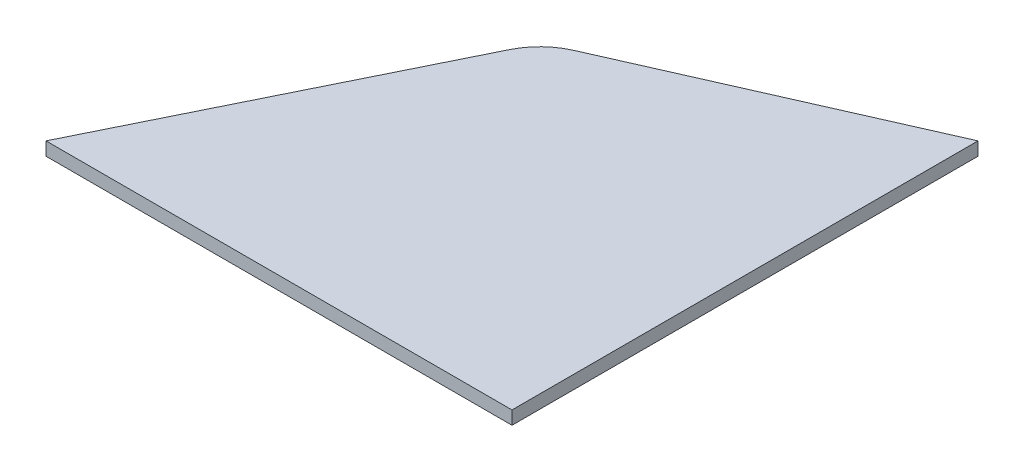
ISO-10303-21;
HEADER;
FILE_DESCRIPTION(('STEP AP214'),'2;1');
FILE_NAME('part.step','',(''),(''),'','','');
FILE_SCHEMA(('AUTOMOTIVE_DESIGN { 1 0 10303 214 1 1 1 1 }'));
ENDSEC;
DATA;
#1=APPLICATION_CONTEXT('core data for automotive mechanical design processes');
#2=APPLICATION_PROTOCOL_DEFINITION('international standard','automotive_design',2000,#1);
#3=PRODUCT_CONTEXT('',#1,'mechanical');
#4=PRODUCT('Part','Part','',(#3));
#5=PRODUCT_RELATED_PRODUCT_CATEGORY('part','',(#4));
#6=PRODUCT_DEFINITION_FORMATION('','',#4);
#7=PRODUCT_DEFINITION_CONTEXT('part definition',#1,'design');
#8=PRODUCT_DEFINITION('design','',#6,#7);
#9=PRODUCT_DEFINITION_SHAPE('','',#8);
#10=(LENGTH_UNIT() NAMED_UNIT(*) SI_UNIT(.MILLI.,.METRE.));
#11=(NAMED_UNIT(*) PLANE_ANGLE_UNIT() SI_UNIT($,.RADIAN.));
#12=(NAMED_UNIT(*) SI_UNIT($,.STERADIAN.) SOLID_ANGLE_UNIT());
#13=UNCERTAINTY_MEASURE_WITH_UNIT(LENGTH_MEASURE(1.E-05),#10,'distance_accuracy_value','');
#14=(GEOMETRIC_REPRESENTATION_CONTEXT(3) GLOBAL_UNCERTAINTY_ASSIGNED_CONTEXT((#13)) GLOBAL_UNIT_ASSIGNED_CONTEXT((#10,
#11,#12)) REPRESENTATION_CONTEXT('',''));
#15=CARTESIAN_POINT('',(0.,0.,0.));
#16=DIRECTION('',(0.,0.,1.));
#17=DIRECTION('',(1.,0.,0.));
#18=AXIS2_PLACEMENT_3D('',#15,#16,#17);
#19=CARTESIAN_POINT('',(24.5442990763072,2.,-49.9521398660407));
#20=DIRECTION('',(0.897508774284861,0.,0.440996598718955));
#21=DIRECTION('',(0.440996598718955,0.,-0.897508774284861));
#22=AXIS2_PLACEMENT_3D('',#19,#20,#21);
#23=PLANE('',#22);
#24=DIRECTION('',(-0.440996598718955,0.,0.897508774284861));
#25=VECTOR('',#24,1.);
#26=CARTESIAN_POINT('',(24.5442990763072,2.,-49.9521398660407));
#27=LINE('',#26,#25);
#28=CARTESIAN_POINT('',(22.9377628448455,2.,-46.6825446625134));
#29=VERTEX_POINT('',#28);
#30=CARTESIAN_POINT('',(0.,2.,0.));
#31=VERTEX_POINT('',#30);
#32=EDGE_CURVE('E86',#29,#31,#27,.T.);
#33=ORIENTED_EDGE('',*,*,#32,.F.);
#34=DIRECTION('',(0.,-1.,0.));
#35=VECTOR('',#34,1.);
#36=CARTESIAN_POINT('',(22.9377628448455,2.,-46.6825446625134));
#37=LINE('',#36,#35);
#38=CARTESIAN_POINT('',(22.9377628448455,0.,-46.6825446625134));
#39=VERTEX_POINT('',#38);
#40=EDGE_CURVE('E112',#29,#39,#37,.T.);
#41=ORIENTED_EDGE('',*,*,#40,.T.);
#42=DIRECTION('',(-0.440996598718955,0.,0.897508774284861));
#43=VECTOR('',#42,1.);
#44=CARTESIAN_POINT('',(24.5442990763072,0.,-49.9521398660407));
#45=LINE('',#44,#43);
#46=CARTESIAN_POINT('',(0.,0.,0.));
#47=VERTEX_POINT('',#46);
#48=EDGE_CURVE('E109',#39,#47,#45,.T.);
#49=ORIENTED_EDGE('',*,*,#48,.T.);
#50=DIRECTION('',(0.,-1.,0.));
#51=VECTOR('',#50,1.);
#52=CARTESIAN_POINT('',(0.,2.,0.));
#53=LINE('',#52,#51);
#54=EDGE_CURVE('E102',#31,#47,#53,.T.);
#55=ORIENTED_EDGE('',*,*,#54,.F.);
#56=EDGE_LOOP('',(#33,#41,#49,#55));
#57=FACE_BOUND('',#56,.T.);
#58=ADVANCED_FACE('F39',(#57),#23,.F.);
#59=CARTESIAN_POINT('',(0.,2.,0.));
#60=DIRECTION('',(0.,0.,-1.));
#61=DIRECTION('',(-1.,0.,0.));
#62=AXIS2_PLACEMENT_3D('',#59,#60,#61);
#63=PLANE('',#62);
#64=DIRECTION('',(1.,0.,0.));
#65=VECTOR('',#64,1.);
#66=CARTESIAN_POINT('',(0.,0.,0.));
#67=LINE('',#66,#65);
#68=CARTESIAN_POINT('',(70.,0.,0.));
#69=VERTEX_POINT('',#68);
#70=EDGE_CURVE('E132',#47,#69,#67,.T.);
#71=ORIENTED_EDGE('',*,*,#70,.T.);
#72=DIRECTION('',(0.,-1.,0.));
#73=VECTOR('',#72,1.);
#74=CARTESIAN_POINT('',(70.,2.,0.));
#75=LINE('',#74,#73);
#76=CARTESIAN_POINT('',(70.,2.,0.));
#77=VERTEX_POINT('',#76);
#78=EDGE_CURVE('E104',#77,#69,#75,.T.);
#79=ORIENTED_EDGE('',*,*,#78,.F.);
#80=DIRECTION('',(1.,0.,0.));
#81=VECTOR('',#80,1.);
#82=CARTESIAN_POINT('',(0.,2.,0.));
#83=LINE('',#82,#81);
#84=EDGE_CURVE('E89',#31,#77,#83,.T.);
#85=ORIENTED_EDGE('',*,*,#84,.F.);
#86=ORIENTED_EDGE('',*,*,#54,.T.);
#87=EDGE_LOOP('',(#71,#79,#85,#86));
#88=FACE_BOUND('',#87,.T.);
#89=ADVANCED_FACE('F101',(#88),#63,.F.);
#90=CARTESIAN_POINT('',(70.,2.,0.));
#91=DIRECTION('',(-1.,0.,0.));
#92=DIRECTION('',(0.,0.,1.));
#93=AXIS2_PLACEMENT_3D('',#90,#91,#92);
#94=PLANE('',#93);
#95=DIRECTION('',(0.,0.,-1.));
#96=VECTOR('',#95,1.);
#97=CARTESIAN_POINT('',(70.,0.,0.));
#98=LINE('',#97,#96);
#99=CARTESIAN_POINT('',(69.9999999999997,0.,-70.));
#100=VERTEX_POINT('',#99);
#101=EDGE_CURVE('E129',#69,#100,#98,.T.);
#102=ORIENTED_EDGE('',*,*,#101,.T.);
#103=DIRECTION('',(0.,-1.,0.));
#104=VECTOR('',#103,1.);
#105=CARTESIAN_POINT('',(69.9999999999997,2.,-70.));
#106=LINE('',#105,#104);
#107=CARTESIAN_POINT('',(69.9999999999997,2.,-70.));
#108=VERTEX_POINT('',#107);
#109=EDGE_CURVE('E117',#108,#100,#106,.T.);
#110=ORIENTED_EDGE('',*,*,#109,.F.);
#111=DIRECTION('',(0.,0.,-1.));
#112=VECTOR('',#111,1.);
#113=CARTESIAN_POINT('',(70.,2.,0.));
#114=LINE('',#113,#112);
#115=EDGE_CURVE('E107',#77,#108,#114,.T.);
#116=ORIENTED_EDGE('',*,*,#115,.F.);
#117=ORIENTED_EDGE('',*,*,#78,.T.);
#118=EDGE_LOOP('',(#102,#110,#116,#117));
#119=FACE_BOUND('',#118,.T.);
#120=ADVANCED_FACE('F142',(#119),#94,.F.);
#121=CARTESIAN_POINT('',(69.9999999999997,2.,-70.));
#122=DIRECTION('',(0.403536993045673,0.,0.914963329999436));
#123=DIRECTION('',(0.914963329999436,0.,-0.403536993045673));
#124=AXIS2_PLACEMENT_3D('',#121,#122,#123);
#125=PLANE('',#124);
#126=DIRECTION('',(-0.914963329999436,0.,0.403536993045673));
#127=VECTOR('',#126,1.);
#128=CARTESIAN_POINT('',(69.9999999999997,0.,-70.));
#129=LINE('',#128,#127);
#130=CARTESIAN_POINT('',(27.8774806572374,0.,-51.4222119753182));
#131=VERTEX_POINT('',#130);
#132=EDGE_CURVE('E97',#100,#131,#129,.T.);
#133=ORIENTED_EDGE('',*,*,#132,.T.);
#134=DIRECTION('',(0.,-1.,0.));
#135=VECTOR('',#134,1.);
#136=CARTESIAN_POINT('',(27.8774806572374,2.,-51.4222119753182));
#137=LINE('',#136,#135);
#138=CARTESIAN_POINT('',(27.8774806572374,2.,-51.4222119753182));
#139=VERTEX_POINT('',#138);
#140=EDGE_CURVE('E48',#131,#139,#137,.F.);
#141=ORIENTED_EDGE('',*,*,#140,.T.);
#142=DIRECTION('',(-0.914963329999436,0.,0.403536993045673));
#143=VECTOR('',#142,1.);
#144=CARTESIAN_POINT('',(69.9999999999997,2.,-70.));
#145=LINE('',#144,#143);
#146=EDGE_CURVE('E126',#108,#139,#145,.T.);
#147=ORIENTED_EDGE('',*,*,#146,.F.);
#148=ORIENTED_EDGE('',*,*,#109,.T.);
#149=EDGE_LOOP('',(#133,#141,#147,#148));
#150=FACE_BOUND('',#149,.T.);
#151=ADVANCED_FACE('F144',(#150),#125,.F.);
#152=CARTESIAN_POINT('',(0.,2.,0.));
#153=DIRECTION('',(0.,1.,0.));
#154=DIRECTION('',(0.,0.,1.));
#155=AXIS2_PLACEMENT_3D('',#152,#153,#154);
#156=PLANE('',#155);
#157=ORIENTED_EDGE('',*,*,#146,.T.);
#158=CARTESIAN_POINT('',(31.9128505876941,2.,-42.2725786753239));
#159=DIRECTION('',(0.,1.,0.));
#160=DIRECTION('',(0.,0.,1.));
#161=AXIS2_PLACEMENT_3D('',#158,#159,#160);
#162=CIRCLE('',#161,10.);
#163=EDGE_CURVE('E11',#139,#29,#162,.T.);
#164=ORIENTED_EDGE('',*,*,#163,.T.);
#165=ORIENTED_EDGE('',*,*,#32,.T.);
#166=ORIENTED_EDGE('',*,*,#84,.T.);
#167=ORIENTED_EDGE('',*,*,#115,.T.);
#168=EDGE_LOOP('',(#157,#164,#165,#166,#167));
#169=FACE_BOUND('',#168,.T.);
#170=ADVANCED_FACE('F88',(#169),#156,.T.);
#171=CARTESIAN_POINT('',(0.,0.,0.));
#172=DIRECTION('',(0.,1.,0.));
#173=DIRECTION('',(0.,0.,1.));
#174=AXIS2_PLACEMENT_3D('',#171,#172,#173);
#175=PLANE('',#174);
#176=ORIENTED_EDGE('',*,*,#48,.F.);
#177=CARTESIAN_POINT('',(31.9128505876941,0.,-42.2725786753239));
#178=DIRECTION('',(0.,1.,0.));
#179=DIRECTION('',(0.,0.,1.));
#180=AXIS2_PLACEMENT_3D('',#177,#178,#179);
#181=CIRCLE('',#180,10.);
#182=EDGE_CURVE('E62',#39,#131,#181,.F.);
#183=ORIENTED_EDGE('',*,*,#182,.T.);
#184=ORIENTED_EDGE('',*,*,#132,.F.);
#185=ORIENTED_EDGE('',*,*,#101,.F.);
#186=ORIENTED_EDGE('',*,*,#70,.F.);
#187=EDGE_LOOP('',(#176,#183,#184,#185,#186));
#188=FACE_BOUND('',#187,.T.);
#189=ADVANCED_FACE('F151',(#188),#175,.F.);
#190=CARTESIAN_POINT('',(31.9128505876941,2.,-42.2725786753239));
#191=DIRECTION('',(0.,-1.,0.));
#192=DIRECTION('',(0.,0.,-1.));
#193=AXIS2_PLACEMENT_3D('',#190,#191,#192);
#194=CYLINDRICAL_SURFACE('',#193,10.);
#195=ORIENTED_EDGE('',*,*,#163,.F.);
#196=ORIENTED_EDGE('',*,*,#140,.F.);
#197=ORIENTED_EDGE('',*,*,#182,.F.);
#198=ORIENTED_EDGE('',*,*,#40,.F.);
#199=EDGE_LOOP('',(#195,#196,#197,#198));
#200=FACE_BOUND('',#199,.T.);
#201=ADVANCED_FACE('F41',(#200),#194,.T.);
#202=CLOSED_SHELL('',(#58,#89,#120,#151,#170,#189,#201));
#203=MANIFOLD_SOLID_BREP('B2',#202);
#204=ADVANCED_BREP_SHAPE_REPRESENTATION('',(#18,#203),#14);
#205=SHAPE_DEFINITION_REPRESENTATION(#9,#204);
ENDSEC;
END-ISO-10303-21;
